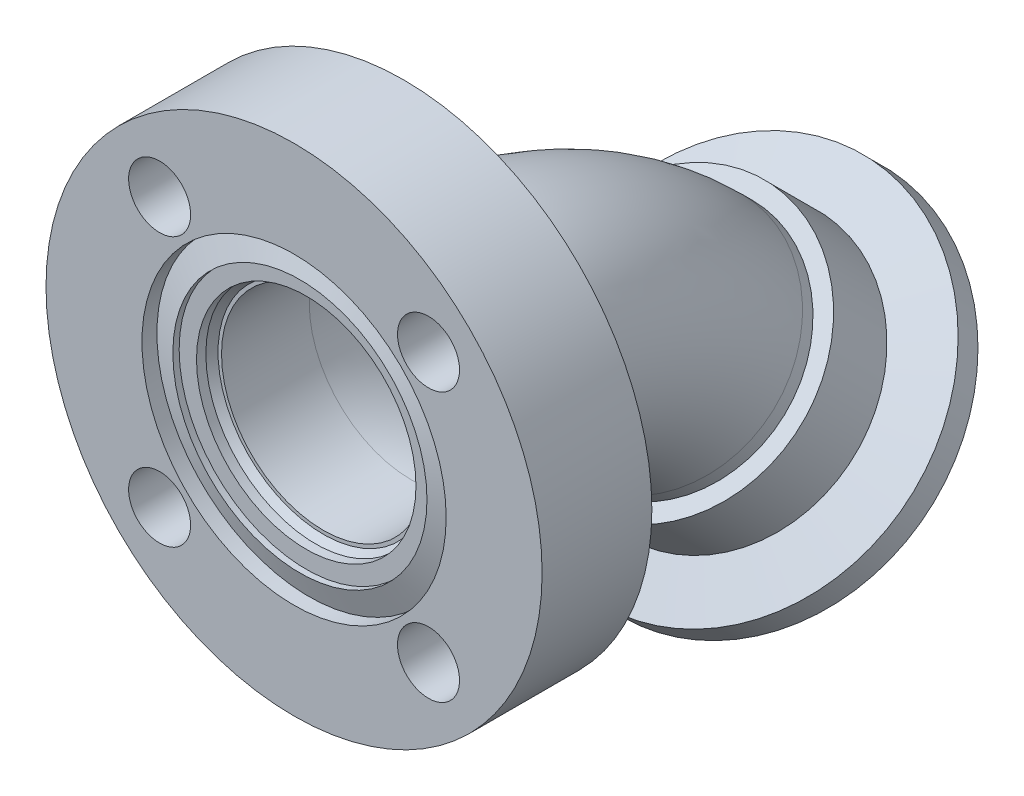
ISO-10303-21;
HEADER;
FILE_DESCRIPTION(('STEP AP214'),'2;1');
FILE_NAME('part.step','',(''),(''),'','','');
FILE_SCHEMA(('AUTOMOTIVE_DESIGN { 1 0 10303 214 1 1 1 1 }'));
ENDSEC;
DATA;
#1=APPLICATION_CONTEXT('core data for automotive mechanical design processes');
#2=APPLICATION_PROTOCOL_DEFINITION('international standard','automotive_design',2000,#1);
#3=PRODUCT_CONTEXT('',#1,'mechanical');
#4=PRODUCT('Part','Part','',(#3));
#5=PRODUCT_RELATED_PRODUCT_CATEGORY('part','',(#4));
#6=PRODUCT_DEFINITION_FORMATION('','',#4);
#7=PRODUCT_DEFINITION_CONTEXT('part definition',#1,'design');
#8=PRODUCT_DEFINITION('design','',#6,#7);
#9=PRODUCT_DEFINITION_SHAPE('','',#8);
#10=(LENGTH_UNIT() NAMED_UNIT(*) SI_UNIT(.MILLI.,.METRE.));
#11=(NAMED_UNIT(*) PLANE_ANGLE_UNIT() SI_UNIT($,.RADIAN.));
#12=(NAMED_UNIT(*) SI_UNIT($,.STERADIAN.) SOLID_ANGLE_UNIT());
#13=UNCERTAINTY_MEASURE_WITH_UNIT(LENGTH_MEASURE(1.E-05),#10,'distance_accuracy_value','');
#14=(GEOMETRIC_REPRESENTATION_CONTEXT(3) GLOBAL_UNCERTAINTY_ASSIGNED_CONTEXT((#13)) GLOBAL_UNIT_ASSIGNED_CONTEXT((#10,
#11,#12)) REPRESENTATION_CONTEXT('',''));
#15=CARTESIAN_POINT('',(0.,0.,0.));
#16=DIRECTION('',(0.,0.,1.));
#17=DIRECTION('',(1.,0.,0.));
#18=AXIS2_PLACEMENT_3D('',#15,#16,#17);
#19=CARTESIAN_POINT('',(0.,-11.1592316367926,-39.6407683632075));
#20=DIRECTION('',(0.,-0.707106781186548,-0.707106781186547));
#21=DIRECTION('',(0.,0.707106781186547,-0.707106781186548));
#22=AXIS2_PLACEMENT_3D('',#19,#20,#21);
#23=CYLINDRICAL_SURFACE('',#22,12.7);
#24=CARTESIAN_POINT('',(0.,-11.1592316367926,-39.6407683632075));
#25=DIRECTION('',(0.,0.707106781186549,0.707106781186546));
#26=DIRECTION('',(1.,0.,0.));
#27=AXIS2_PLACEMENT_3D('',#24,#25,#26);
#28=CIRCLE('',#27,12.7);
#29=CARTESIAN_POINT('',(0.,-2.17897551572345,-48.6210244842767));
#30=VERTEX_POINT('',#29);
#31=EDGE_CURVE('E103',#30,#30,#28,.T.);
#32=ORIENTED_EDGE('',*,*,#31,.F.);
#33=EDGE_LOOP('',(#32));
#34=FACE_BOUND('',#33,.T.);
#35=CARTESIAN_POINT('',(0.,-12.2907439080473,-40.7722806344622));
#36=DIRECTION('',(0.,-0.707106781186547,-0.707106781186548));
#37=DIRECTION('',(0.,0.707106781186548,-0.707106781186547));
#38=AXIS2_PLACEMENT_3D('',#35,#36,#37);
#39=CIRCLE('',#38,12.7);
#40=CARTESIAN_POINT('',(0.,-3.31048778697815,-49.7525367555314));
#41=VERTEX_POINT('',#40);
#42=EDGE_CURVE('E10',#41,#41,#39,.T.);
#43=ORIENTED_EDGE('',*,*,#42,.F.);
#44=EDGE_LOOP('',(#43));
#45=FACE_BOUND('',#44,.T.);
#46=ADVANCED_FACE('F32',(#34,#45),#23,.T.);
#47=CARTESIAN_POINT('',(0.,-17.8944237275945,-46.3759604540094));
#48=DIRECTION('',(0.,0.707106781186549,0.707106781186546));
#49=DIRECTION('',(1.,0.,0.));
#50=AXIS2_PLACEMENT_3D('',#47,#48,#49);
#51=PLANE('',#50);
#52=CARTESIAN_POINT('',(0.,-17.8944237275945,-46.3759604540094));
#53=DIRECTION('',(0.,0.707106781186549,0.707106781186546));
#54=DIRECTION('',(1.,0.,0.));
#55=AXIS2_PLACEMENT_3D('',#52,#53,#54);
#56=CIRCLE('',#55,11.049);
#57=CARTESIAN_POINT('',(0.,-10.0816009022643,-54.1887832793395));
#58=VERTEX_POINT('',#57);
#59=EDGE_CURVE('E56',#58,#58,#56,.T.);
#60=ORIENTED_EDGE('',*,*,#59,.T.);
#61=EDGE_LOOP('',(#60));
#62=FACE_BOUND('',#61,.T.);
#63=CARTESIAN_POINT('',(0.,-17.8944237275945,-46.3759604540094));
#64=DIRECTION('',(0.,0.707106781186549,0.707106781186546));
#65=DIRECTION('',(0.,-0.707106781186546,0.707106781186549));
#66=AXIS2_PLACEMENT_3D('',#63,#64,#65);
#67=CIRCLE('',#66,11.986032820047);
#68=CARTESIAN_POINT('',(0.,-26.3698288141742,-37.9005553674296));
#69=VERTEX_POINT('',#68);
#70=EDGE_CURVE('E39',#69,#69,#67,.T.);
#71=ORIENTED_EDGE('',*,*,#70,.F.);
#72=EDGE_LOOP('',(#71));
#73=FACE_BOUND('',#72,.T.);
#74=ADVANCED_FACE('F188',(#62,#73),#51,.F.);
#75=CARTESIAN_POINT('',(0.,0.,0.));
#76=DIRECTION('',(0.,0.,1.));
#77=DIRECTION('',(1.,0.,0.));
#78=AXIS2_PLACEMENT_3D('',#75,#76,#77);
#79=CYLINDRICAL_SURFACE('',#78,16.51);
#80=CARTESIAN_POINT('',(0.,0.,-1.62419830268869));
#81=DIRECTION('',(0.,0.,1.));
#82=DIRECTION('',(1.,0.,0.));
#83=AXIS2_PLACEMENT_3D('',#80,#81,#82);
#84=CIRCLE('',#83,16.51);
#85=CARTESIAN_POINT('',(16.51,0.,-1.62419830268869));
#86=VERTEX_POINT('',#85);
#87=EDGE_CURVE('E75',#86,#86,#84,.T.);
#88=ORIENTED_EDGE('',*,*,#87,.F.);
#89=EDGE_LOOP('',(#88));
#90=FACE_BOUND('',#89,.T.);
#91=CARTESIAN_POINT('',(0.,0.,0.));
#92=DIRECTION('',(0.,0.,1.));
#93=DIRECTION('',(1.,0.,0.));
#94=AXIS2_PLACEMENT_3D('',#91,#92,#93);
#95=CIRCLE('',#94,16.51);
#96=CARTESIAN_POINT('',(16.51,0.,0.));
#97=VERTEX_POINT('',#96);
#98=EDGE_CURVE('E43',#97,#97,#95,.T.);
#99=ORIENTED_EDGE('',*,*,#98,.T.);
#100=EDGE_LOOP('',(#99));
#101=FACE_BOUND('',#100,.T.);
#102=ADVANCED_FACE('F34',(#90,#101),#79,.F.);
#103=CARTESIAN_POINT('',(0.,26.924,0.));
#104=DIRECTION('',(0.,0.,-1.));
#105=DIRECTION('',(-1.,0.,0.));
#106=AXIS2_PLACEMENT_3D('',#103,#104,#105);
#107=PLANE('',#106);
#108=CARTESIAN_POINT('',(14.5923000000002,-14.5935323674563,0.));
#109=DIRECTION('',(0.,0.,1.));
#110=DIRECTION('',(0.,-1.,0.));
#111=AXIS2_PLACEMENT_3D('',#108,#109,#110);
#112=CIRCLE('',#111,3.3655);
#113=CARTESIAN_POINT('',(14.5923000000002,-17.9590323674563,0.));
#114=VERTEX_POINT('',#113);
#115=EDGE_CURVE('E53',#114,#114,#112,.T.);
#116=ORIENTED_EDGE('',*,*,#115,.F.);
#117=EDGE_LOOP('',(#116));
#118=FACE_BOUND('',#117,.T.);
#119=CARTESIAN_POINT('',(-14.5935323674565,-14.5923,0.));
#120=DIRECTION('',(0.,0.,1.));
#121=DIRECTION('',(-1.,0.,0.));
#122=AXIS2_PLACEMENT_3D('',#119,#120,#121);
#123=CIRCLE('',#122,3.3655);
#124=CARTESIAN_POINT('',(-17.9590323674565,-14.5923,0.));
#125=VERTEX_POINT('',#124);
#126=EDGE_CURVE('E91',#125,#125,#123,.T.);
#127=ORIENTED_EDGE('',*,*,#126,.F.);
#128=EDGE_LOOP('',(#127));
#129=FACE_BOUND('',#128,.T.);
#130=CARTESIAN_POINT('',(-14.5923,14.5935323674564,0.));
#131=DIRECTION('',(0.,0.,1.));
#132=DIRECTION('',(0.,1.,0.));
#133=AXIS2_PLACEMENT_3D('',#130,#131,#132);
#134=CIRCLE('',#133,3.3655);
#135=CARTESIAN_POINT('',(-14.5923000000001,17.9590323674564,0.));
#136=VERTEX_POINT('',#135);
#137=EDGE_CURVE('E85',#136,#136,#134,.T.);
#138=ORIENTED_EDGE('',*,*,#137,.F.);
#139=EDGE_LOOP('',(#138));
#140=FACE_BOUND('',#139,.T.);
#141=CARTESIAN_POINT('',(14.5935323674565,14.5923,0.));
#142=DIRECTION('',(0.,0.,1.));
#143=DIRECTION('',(1.,0.,0.));
#144=AXIS2_PLACEMENT_3D('',#141,#142,#143);
#145=CIRCLE('',#144,3.3655);
#146=CARTESIAN_POINT('',(17.9590323674565,14.5923,0.));
#147=VERTEX_POINT('',#146);
#148=EDGE_CURVE('E79',#147,#147,#145,.T.);
#149=ORIENTED_EDGE('',*,*,#148,.F.);
#150=EDGE_LOOP('',(#149));
#151=FACE_BOUND('',#150,.T.);
#152=ORIENTED_EDGE('',*,*,#98,.F.);
#153=EDGE_LOOP('',(#152));
#154=FACE_BOUND('',#153,.T.);
#155=CARTESIAN_POINT('',(0.,0.,0.));
#156=DIRECTION('',(0.,0.,1.));
#157=DIRECTION('',(1.,0.,0.));
#158=AXIS2_PLACEMENT_3D('',#155,#156,#157);
#159=CIRCLE('',#158,26.924);
#160=CARTESIAN_POINT('',(26.924,0.,0.));
#161=VERTEX_POINT('',#160);
#162=EDGE_CURVE('E47',#161,#161,#159,.T.);
#163=ORIENTED_EDGE('',*,*,#162,.T.);
#164=EDGE_LOOP('',(#163));
#165=FACE_BOUND('',#164,.T.);
#166=ADVANCED_FACE('F244',(#118,#129,#140,#151,#154,#165),#107,.F.);
#167=CARTESIAN_POINT('',(0.,0.,0.));
#168=DIRECTION('',(0.,0.,1.));
#169=DIRECTION('',(1.,0.,0.));
#170=AXIS2_PLACEMENT_3D('',#167,#168,#169);
#171=CYLINDRICAL_SURFACE('',#170,26.924);
#172=ORIENTED_EDGE('',*,*,#162,.F.);
#173=EDGE_LOOP('',(#172));
#174=FACE_BOUND('',#173,.T.);
#175=CARTESIAN_POINT('',(0.,0.,-11.9126));
#176=DIRECTION('',(0.,0.,1.));
#177=DIRECTION('',(1.,0.,0.));
#178=AXIS2_PLACEMENT_3D('',#175,#176,#177);
#179=CIRCLE('',#178,26.924);
#180=CARTESIAN_POINT('',(26.924,0.,-11.9126));
#181=VERTEX_POINT('',#180);
#182=EDGE_CURVE('E60',#181,#181,#179,.T.);
#183=ORIENTED_EDGE('',*,*,#182,.T.);
#184=EDGE_LOOP('',(#183));
#185=FACE_BOUND('',#184,.T.);
#186=ADVANCED_FACE('F241',(#174,#185),#171,.T.);
#187=CARTESIAN_POINT('',(0.,26.924,-11.9126));
#188=DIRECTION('',(0.,0.,1.));
#189=DIRECTION('',(1.,0.,0.));
#190=AXIS2_PLACEMENT_3D('',#187,#188,#189);
#191=PLANE('',#190);
#192=CARTESIAN_POINT('',(0.,0.,-11.9126));
#193=DIRECTION('',(0.,0.,1.));
#194=DIRECTION('',(1.,0.,0.));
#195=AXIS2_PLACEMENT_3D('',#192,#193,#194);
#196=CIRCLE('',#195,12.7);
#197=CARTESIAN_POINT('',(12.7,0.,-11.9126));
#198=VERTEX_POINT('',#197);
#199=EDGE_CURVE('E50',#198,#198,#196,.T.);
#200=ORIENTED_EDGE('',*,*,#199,.T.);
#201=EDGE_LOOP('',(#200));
#202=FACE_BOUND('',#201,.T.);
#203=CARTESIAN_POINT('',(14.5923000000002,-14.5935323674563,-11.9126));
#204=DIRECTION('',(0.,0.,1.));
#205=DIRECTION('',(0.,-1.,0.));
#206=AXIS2_PLACEMENT_3D('',#203,#204,#205);
#207=CIRCLE('',#206,3.3655);
#208=CARTESIAN_POINT('',(14.5923000000002,-17.9590323674563,-11.9126));
#209=VERTEX_POINT('',#208);
#210=EDGE_CURVE('E94',#209,#209,#207,.T.);
#211=ORIENTED_EDGE('',*,*,#210,.T.);
#212=EDGE_LOOP('',(#211));
#213=FACE_BOUND('',#212,.T.);
#214=CARTESIAN_POINT('',(-14.5935323674565,-14.5923,-11.9126));
#215=DIRECTION('',(0.,0.,1.));
#216=DIRECTION('',(-1.,0.,0.));
#217=AXIS2_PLACEMENT_3D('',#214,#215,#216);
#218=CIRCLE('',#217,3.3655);
#219=CARTESIAN_POINT('',(-17.9590323674565,-14.5923,-11.9126));
#220=VERTEX_POINT('',#219);
#221=EDGE_CURVE('E88',#220,#220,#218,.T.);
#222=ORIENTED_EDGE('',*,*,#221,.T.);
#223=EDGE_LOOP('',(#222));
#224=FACE_BOUND('',#223,.T.);
#225=CARTESIAN_POINT('',(-14.5923,14.5935323674564,-11.9126));
#226=DIRECTION('',(0.,0.,1.));
#227=DIRECTION('',(0.,1.,0.));
#228=AXIS2_PLACEMENT_3D('',#225,#226,#227);
#229=CIRCLE('',#228,3.3655);
#230=CARTESIAN_POINT('',(-14.5923000000001,17.9590323674564,-11.9126));
#231=VERTEX_POINT('',#230);
#232=EDGE_CURVE('E82',#231,#231,#229,.T.);
#233=ORIENTED_EDGE('',*,*,#232,.T.);
#234=EDGE_LOOP('',(#233));
#235=FACE_BOUND('',#234,.T.);
#236=CARTESIAN_POINT('',(14.5935323674565,14.5923,-11.9126));
#237=DIRECTION('',(0.,0.,1.));
#238=DIRECTION('',(1.,0.,0.));
#239=AXIS2_PLACEMENT_3D('',#236,#237,#238);
#240=CIRCLE('',#239,3.3655);
#241=CARTESIAN_POINT('',(17.9590323674565,14.5923,-11.9126));
#242=VERTEX_POINT('',#241);
#243=EDGE_CURVE('E78',#242,#242,#240,.T.);
#244=ORIENTED_EDGE('',*,*,#243,.T.);
#245=EDGE_LOOP('',(#244));
#246=FACE_BOUND('',#245,.T.);
#247=ORIENTED_EDGE('',*,*,#182,.F.);
#248=EDGE_LOOP('',(#247));
#249=FACE_BOUND('',#248,.T.);
#250=ADVANCED_FACE('F237',(#202,#213,#224,#235,#246,#249),#191,.F.);
#251=CARTESIAN_POINT('',(0.,0.,-2.3368));
#252=DIRECTION('',(0.,0.,1.));
#253=DIRECTION('',(1.,0.,0.));
#254=AXIS2_PLACEMENT_3D('',#251,#252,#253);
#255=CONICAL_SURFACE('',#254,11.9126,0.5235987755983);
#256=CARTESIAN_POINT('',(0.,0.,-3.175));
#257=DIRECTION('',(0.,0.,1.));
#258=DIRECTION('',(1.,0.,0.));
#259=AXIS2_PLACEMENT_3D('',#256,#257,#258);
#260=CIRCLE('',#259,11.4286650043653);
#261=CARTESIAN_POINT('',(11.4286650043653,0.,-3.175));
#262=VERTEX_POINT('',#261);
#263=EDGE_CURVE('E54',#262,#262,#260,.F.);
#264=ORIENTED_EDGE('',*,*,#263,.T.);
#265=EDGE_LOOP('',(#264));
#266=FACE_BOUND('',#265,.T.);
#267=CARTESIAN_POINT('',(0.,0.,-2.3368));
#268=DIRECTION('',(0.,0.,1.));
#269=DIRECTION('',(1.,0.,0.));
#270=AXIS2_PLACEMENT_3D('',#267,#268,#269);
#271=CIRCLE('',#270,11.9126);
#272=CARTESIAN_POINT('',(11.9126,0.,-2.3368));
#273=VERTEX_POINT('',#272);
#274=EDGE_CURVE('E63',#273,#273,#271,.T.);
#275=ORIENTED_EDGE('',*,*,#274,.T.);
#276=EDGE_LOOP('',(#275));
#277=FACE_BOUND('',#276,.T.);
#278=ADVANCED_FACE('F233',(#266,#277),#255,.F.);
#279=CARTESIAN_POINT('',(0.,0.,0.));
#280=DIRECTION('',(0.,0.,1.));
#281=DIRECTION('',(1.,0.,0.));
#282=AXIS2_PLACEMENT_3D('',#279,#280,#281);
#283=CYLINDRICAL_SURFACE('',#282,11.9126);
#284=ORIENTED_EDGE('',*,*,#274,.F.);
#285=EDGE_LOOP('',(#284));
#286=FACE_BOUND('',#285,.T.);
#287=CARTESIAN_POINT('',(0.,0.,-1.3208));
#288=DIRECTION('',(0.,0.,1.));
#289=DIRECTION('',(1.,0.,0.));
#290=AXIS2_PLACEMENT_3D('',#287,#288,#289);
#291=CIRCLE('',#290,11.9126);
#292=CARTESIAN_POINT('',(11.9126,0.,-1.3208));
#293=VERTEX_POINT('',#292);
#294=EDGE_CURVE('E66',#293,#293,#291,.T.);
#295=ORIENTED_EDGE('',*,*,#294,.T.);
#296=EDGE_LOOP('',(#295));
#297=FACE_BOUND('',#296,.T.);
#298=ADVANCED_FACE('F229',(#286,#297),#283,.F.);
#299=CARTESIAN_POINT('',(0.,13.7922,-1.3208));
#300=DIRECTION('',(0.,0.,-1.));
#301=DIRECTION('',(-1.,0.,0.));
#302=AXIS2_PLACEMENT_3D('',#299,#300,#301);
#303=PLANE('',#302);
#304=ORIENTED_EDGE('',*,*,#294,.F.);
#305=EDGE_LOOP('',(#304));
#306=FACE_BOUND('',#305,.T.);
#307=CARTESIAN_POINT('',(0.,0.,-1.3208));
#308=DIRECTION('',(0.,0.,1.));
#309=DIRECTION('',(1.,0.,0.));
#310=AXIS2_PLACEMENT_3D('',#307,#308,#309);
#311=CIRCLE('',#310,13.7922);
#312=CARTESIAN_POINT('',(13.7922,0.,-1.3208));
#313=VERTEX_POINT('',#312);
#314=EDGE_CURVE('E69',#313,#313,#311,.T.);
#315=ORIENTED_EDGE('',*,*,#314,.T.);
#316=EDGE_LOOP('',(#315));
#317=FACE_BOUND('',#316,.T.);
#318=ADVANCED_FACE('F225',(#306,#317),#303,.F.);
#319=CARTESIAN_POINT('',(0.,0.,0.));
#320=DIRECTION('',(0.,0.,1.));
#321=DIRECTION('',(1.,0.,0.));
#322=AXIS2_PLACEMENT_3D('',#319,#320,#321);
#323=CYLINDRICAL_SURFACE('',#322,13.7922);
#324=ORIENTED_EDGE('',*,*,#314,.F.);
#325=EDGE_LOOP('',(#324));
#326=FACE_BOUND('',#325,.T.);
#327=CARTESIAN_POINT('',(0.,0.,-0.635000000000002));
#328=DIRECTION('',(0.,0.,1.));
#329=DIRECTION('',(1.,0.,0.));
#330=AXIS2_PLACEMENT_3D('',#327,#328,#329);
#331=CIRCLE('',#330,13.7922);
#332=CARTESIAN_POINT('',(13.7922,0.,-0.635000000000002));
#333=VERTEX_POINT('',#332);
#334=EDGE_CURVE('E72',#333,#333,#331,.T.);
#335=ORIENTED_EDGE('',*,*,#334,.T.);
#336=EDGE_LOOP('',(#335));
#337=FACE_BOUND('',#336,.T.);
#338=ADVANCED_FACE('F221',(#326,#337),#323,.F.);
#339=CARTESIAN_POINT('',(0.,0.,-1.62419830268869));
#340=DIRECTION('',(0.,0.,-1.));
#341=DIRECTION('',(-1.,0.,0.));
#342=AXIS2_PLACEMENT_3D('',#339,#340,#341);
#343=CONICAL_SURFACE('',#342,16.51,1.22173047639603);
#344=ORIENTED_EDGE('',*,*,#334,.F.);
#345=EDGE_LOOP('',(#344));
#346=FACE_BOUND('',#345,.T.);
#347=ORIENTED_EDGE('',*,*,#87,.T.);
#348=EDGE_LOOP('',(#347));
#349=FACE_BOUND('',#348,.T.);
#350=ADVANCED_FACE('F217',(#346,#349),#343,.T.);
#351=CARTESIAN_POINT('',(14.5935323674565,14.5923,-11.9126));
#352=DIRECTION('',(0.,0.,1.));
#353=DIRECTION('',(1.,0.,0.));
#354=AXIS2_PLACEMENT_3D('',#351,#352,#353);
#355=CYLINDRICAL_SURFACE('',#354,3.3655);
#356=ORIENTED_EDGE('',*,*,#243,.F.);
#357=EDGE_LOOP('',(#356));
#358=FACE_BOUND('',#357,.T.);
#359=ORIENTED_EDGE('',*,*,#148,.T.);
#360=EDGE_LOOP('',(#359));
#361=FACE_BOUND('',#360,.T.);
#362=ADVANCED_FACE('F213',(#358,#361),#355,.F.);
#363=CARTESIAN_POINT('',(-14.5923,14.5935323674564,-11.9126));
#364=DIRECTION('',(0.,0.,1.));
#365=DIRECTION('',(1.,0.,0.));
#366=AXIS2_PLACEMENT_3D('',#363,#364,#365);
#367=CYLINDRICAL_SURFACE('',#366,3.3655);
#368=ORIENTED_EDGE('',*,*,#232,.F.);
#369=EDGE_LOOP('',(#368));
#370=FACE_BOUND('',#369,.T.);
#371=ORIENTED_EDGE('',*,*,#137,.T.);
#372=EDGE_LOOP('',(#371));
#373=FACE_BOUND('',#372,.T.);
#374=ADVANCED_FACE('F209',(#370,#373),#367,.F.);
#375=CARTESIAN_POINT('',(-14.5935323674565,-14.5923,-11.9126));
#376=DIRECTION('',(0.,0.,1.));
#377=DIRECTION('',(1.,0.,0.));
#378=AXIS2_PLACEMENT_3D('',#375,#376,#377);
#379=CYLINDRICAL_SURFACE('',#378,3.3655);
#380=ORIENTED_EDGE('',*,*,#221,.F.);
#381=EDGE_LOOP('',(#380));
#382=FACE_BOUND('',#381,.T.);
#383=ORIENTED_EDGE('',*,*,#126,.T.);
#384=EDGE_LOOP('',(#383));
#385=FACE_BOUND('',#384,.T.);
#386=ADVANCED_FACE('F205',(#382,#385),#379,.F.);
#387=CARTESIAN_POINT('',(14.5923000000002,-14.5935323674563,-11.9126));
#388=DIRECTION('',(0.,0.,1.));
#389=DIRECTION('',(1.,0.,0.));
#390=AXIS2_PLACEMENT_3D('',#387,#388,#389);
#391=CYLINDRICAL_SURFACE('',#390,3.3655);
#392=ORIENTED_EDGE('',*,*,#210,.F.);
#393=EDGE_LOOP('',(#392));
#394=FACE_BOUND('',#393,.T.);
#395=ORIENTED_EDGE('',*,*,#115,.T.);
#396=EDGE_LOOP('',(#395));
#397=FACE_BOUND('',#396,.T.);
#398=ADVANCED_FACE('F201',(#394,#397),#391,.F.);
#399=CARTESIAN_POINT('',(0.,0.,-12.7));
#400=DIRECTION('',(0.,0.,1.));
#401=DIRECTION('',(0.,-1.,0.));
#402=AXIS2_PLACEMENT_3D('',#399,#400,#401);
#403=CYLINDRICAL_SURFACE('',#402,12.7);
#404=CARTESIAN_POINT('',(0.,0.,-12.7));
#405=DIRECTION('',(0.,0.,1.));
#406=DIRECTION('',(1.,0.,0.));
#407=AXIS2_PLACEMENT_3D('',#404,#405,#406);
#408=CIRCLE('',#407,12.7);
#409=CARTESIAN_POINT('',(0.,12.7,-12.7));
#410=VERTEX_POINT('',#409);
#411=EDGE_CURVE('E109',#410,#410,#408,.T.);
#412=ORIENTED_EDGE('',*,*,#411,.T.);
#413=EDGE_LOOP('',(#412));
#414=FACE_BOUND('',#413,.T.);
#415=ORIENTED_EDGE('',*,*,#199,.F.);
#416=EDGE_LOOP('',(#415));
#417=FACE_BOUND('',#416,.T.);
#418=ADVANCED_FACE('F204',(#414,#417),#403,.T.);
#419=CARTESIAN_POINT('',(0.,0.,-3.175));
#420=DIRECTION('',(0.,0.,1.));
#421=DIRECTION('',(1.,0.,0.));
#422=AXIS2_PLACEMENT_3D('',#419,#420,#421);
#423=PLANE('',#422);
#424=CARTESIAN_POINT('',(0.,0.,-3.175));
#425=DIRECTION('',(0.,0.,1.));
#426=DIRECTION('',(1.,0.,0.));
#427=AXIS2_PLACEMENT_3D('',#424,#425,#426);
#428=CIRCLE('',#427,11.049);
#429=CARTESIAN_POINT('',(11.049,0.,-3.175));
#430=VERTEX_POINT('',#429);
#431=EDGE_CURVE('E110',#430,#430,#428,.T.);
#432=ORIENTED_EDGE('',*,*,#431,.F.);
#433=EDGE_LOOP('',(#432));
#434=FACE_BOUND('',#433,.T.);
#435=ORIENTED_EDGE('',*,*,#263,.F.);
#436=EDGE_LOOP('',(#435));
#437=FACE_BOUND('',#436,.T.);
#438=ADVANCED_FACE('F358',(#434,#437),#423,.T.);
#439=CARTESIAN_POINT('',(0.,-11.1592316367926,-39.6407683632075));
#440=DIRECTION('',(0.,-0.707106781186548,-0.707106781186547));
#441=DIRECTION('',(0.,0.707106781186547,-0.707106781186548));
#442=AXIS2_PLACEMENT_3D('',#439,#440,#441);
#443=CYLINDRICAL_SURFACE('',#442,11.049);
#444=CARTESIAN_POINT('',(0.,-11.1592316367926,-39.6407683632075));
#445=DIRECTION('',(0.,0.707106781186549,0.707106781186546));
#446=DIRECTION('',(1.,0.,0.));
#447=AXIS2_PLACEMENT_3D('',#444,#445,#446);
#448=CIRCLE('',#447,11.049);
#449=CARTESIAN_POINT('',(0.,-3.34640881146244,-47.4535911885377));
#450=VERTEX_POINT('',#449);
#451=EDGE_CURVE('E106',#450,#450,#448,.T.);
#452=CARTESIAN_POINT('',(0.,-3.34640881146244,-47.4535911885377));
#453=CARTESIAN_POINT('',(0.,-3.41656706240829,-47.5237494394835));
#454=CARTESIAN_POINT('',(0.,-3.48672531335415,-47.5939076904294));
#455=CARTESIAN_POINT('',(0.,-3.62704181524585,-47.7342241923211));
#456=CARTESIAN_POINT('',(0.,-3.6972000661917,-47.8043824432669));
#457=CARTESIAN_POINT('',(0.,-3.83751656808341,-47.9446989451586));
#458=CARTESIAN_POINT('',(0.,-3.90767481902926,-48.0148571961045));
#459=CARTESIAN_POINT('',(0.,-4.04799132092097,-48.1551736979962));
#460=CARTESIAN_POINT('',(0.,-4.11814957186682,-48.2253319489421));
#461=CARTESIAN_POINT('',(0.,-4.25846607375852,-48.3656484508338));
#462=CARTESIAN_POINT('',(0.,-4.32862432470438,-48.4358067017796));
#463=CARTESIAN_POINT('',(0.,-4.46894082659608,-48.5761232036713));
#464=CARTESIAN_POINT('',(0.,-4.53909907754194,-48.6462814546172));
#465=CARTESIAN_POINT('',(0.,-4.67941557943364,-48.7865979565089));
#466=CARTESIAN_POINT('',(0.,-4.74957383037949,-48.8567562074547));
#467=CARTESIAN_POINT('',(0.,-4.8898903322712,-48.9970727093464));
#468=CARTESIAN_POINT('',(0.,-4.96004858321705,-49.0672309602923));
#469=CARTESIAN_POINT('',(0.,-5.10036508510876,-49.207547462184));
#470=CARTESIAN_POINT('',(0.,-5.17052333605461,-49.2777057131298));
#471=CARTESIAN_POINT('',(0.,-5.31083983794632,-49.4180222150216));
#472=CARTESIAN_POINT('',(0.,-5.38099808889217,-49.4881804659674));
#473=CARTESIAN_POINT('',(0.,-5.52131459078388,-49.6284969678591));
#474=CARTESIAN_POINT('',(0.,-5.59147284172973,-49.698655218805));
#475=CARTESIAN_POINT('',(0.,-5.73178934362143,-49.8389717206967));
#476=CARTESIAN_POINT('',(0.,-5.80194759456729,-49.9091299716425));
#477=CARTESIAN_POINT('',(0.,-5.94226409645899,-50.0494464735342));
#478=CARTESIAN_POINT('',(0.,-6.01242234740484,-50.1196047244801));
#479=CARTESIAN_POINT('',(0.,-6.15273884929655,-50.2599212263718));
#480=CARTESIAN_POINT('',(0.,-6.2228971002424,-50.3300794773176));
#481=CARTESIAN_POINT('',(0.,-6.36321360213411,-50.4703959792093));
#482=CARTESIAN_POINT('',(0.,-6.43337185307996,-50.5405542301552));
#483=CARTESIAN_POINT('',(0.,-6.57368835497167,-50.6808707320469));
#484=CARTESIAN_POINT('',(0.,-6.64384660591752,-50.7510289829927));
#485=CARTESIAN_POINT('',(0.,-6.78416310780922,-50.8913454848845));
#486=CARTESIAN_POINT('',(0.,-6.85432135875508,-50.9615037358303));
#487=CARTESIAN_POINT('',(0.,-6.99463786064678,-51.101820237722));
#488=CARTESIAN_POINT('',(0.,-7.06479611159263,-51.1719784886679));
#489=CARTESIAN_POINT('',(0.,-7.20511261348434,-51.3122949905596));
#490=CARTESIAN_POINT('',(0.,-7.27527086443019,-51.3824532415054));
#491=CARTESIAN_POINT('',(0.,-7.4155873663219,-51.5227697433971));
#492=CARTESIAN_POINT('',(0.,-7.48574561726775,-51.592927994343));
#493=CARTESIAN_POINT('',(0.,-7.62606211915946,-51.7332444962347));
#494=CARTESIAN_POINT('',(0.,-7.69622037010531,-51.8034027471805));
#495=CARTESIAN_POINT('',(0.,-7.83653687199702,-51.9437192490722));
#496=CARTESIAN_POINT('',(0.,-7.90669512294287,-52.0138775000181));
#497=CARTESIAN_POINT('',(0.,-8.04701162483457,-52.1541940019098));
#498=CARTESIAN_POINT('',(0.,-8.11716987578043,-52.2243522528557));
#499=CARTESIAN_POINT('',(0.,-8.25748637767213,-52.3646687547474));
#500=CARTESIAN_POINT('',(0.,-8.32764462861798,-52.4348270056932));
#501=CARTESIAN_POINT('',(0.,-8.46796113050969,-52.5751435075849));
#502=CARTESIAN_POINT('',(0.,-8.53811938145554,-52.6453017585308));
#503=CARTESIAN_POINT('',(0.,-8.67843588334725,-52.7856182604225));
#504=CARTESIAN_POINT('',(0.,-8.7485941342931,-52.8557765113683));
#505=CARTESIAN_POINT('',(0.,-8.88891063618481,-52.99609301326));
#506=CARTESIAN_POINT('',(0.,-8.95906888713066,-53.0662512642059));
#507=CARTESIAN_POINT('',(0.,-9.09938538902237,-53.2065677660976));
#508=CARTESIAN_POINT('',(0.,-9.16954363996822,-53.2767260170434));
#509=CARTESIAN_POINT('',(0.,-9.30986014185993,-53.4170425189352));
#510=CARTESIAN_POINT('',(0.,-9.38001839280578,-53.487200769881));
#511=CARTESIAN_POINT('',(0.,-9.52033489469748,-53.6275172717727));
#512=CARTESIAN_POINT('',(0.,-9.59049314564333,-53.6976755227186));
#513=CARTESIAN_POINT('',(0.,-9.73080964753504,-53.8379920246103));
#514=CARTESIAN_POINT('',(0.,-9.80096789848089,-53.9081502755561));
#515=CARTESIAN_POINT('',(0.,-9.9412844003726,-54.0484667774478));
#516=CARTESIAN_POINT('',(0.,-10.0114426513184,-54.1186250283937));
#517=CARTESIAN_POINT('',(0.,-10.0816009022643,-54.1887832793395));
#518=B_SPLINE_CURVE_WITH_KNOTS('',3,(#452,#453,#454,#455,#456,#457,#458,#459,#460,#461,#462,
#463,#464,#465,#466,#467,#468,#469,#470,#471,#472,#473,#474,#475,#476,#477,#478,#479,#480,#481,
#482,#483,#484,#485,#486,#487,#488,#489,#490,#491,#492,#493,#494,#495,#496,#497,#498,#499,#500,
#501,#502,#503,#504,#505,#506,#507,#508,#509,#510,#511,#512,#513,#514,#515,#516,#517),
.UNSPECIFIED.,.F.,.F.,(4,2,2,2,2,2,2,2,2,2,2,2,2,2,2,2,2,2,2,2,2,2,2,2,2,2,2,2,2,2,2,2,4),(0.,
0.29765625,0.5953125,0.89296875,1.190625,1.48828125,1.7859375,2.08359375,2.38125,2.67890625,
2.9765625,3.27421875,3.571875,3.86953125,4.1671875,4.46484374999999,4.7625,5.06015625,5.3578125,
5.65546875,5.953125,6.25078125,6.5484375,6.84609375,7.14375,7.44140625,7.7390625,8.03671875,
8.334375,8.63203125,8.92968749999999,9.22734375,9.525),.UNSPECIFIED.);
#519=EDGE_CURVE('BSEAM199',#450,#58,#518,.T.);
#520=ORIENTED_EDGE('',*,*,#451,.T.);
#521=ORIENTED_EDGE('',*,*,#59,.F.);
#522=ORIENTED_EDGE('',*,*,#519,.T.);
#523=ORIENTED_EDGE('',*,*,#519,.F.);
#524=EDGE_LOOP('',(#520,#522,#521,#523));
#525=FACE_BOUND('',#524,.T.);
#526=ADVANCED_FACE('F199',(#525),#443,.F.);
#527=CARTESIAN_POINT('',(0.,-38.1,-12.7));
#528=DIRECTION('',(-1.,0.,0.));
#529=DIRECTION('',(0.,0.,1.));
#530=AXIS2_PLACEMENT_3D('',#527,#528,#529);
#531=TOROIDAL_SURFACE('',#530,38.1,12.7);
#532=CARTESIAN_POINT('',(0.,-38.1,-12.7));
#533=DIRECTION('',(-1.,0.,0.));
#534=DIRECTION('',(0.,0.,1.));
#535=AXIS2_PLACEMENT_3D('',#532,#533,#534);
#536=CIRCLE('',#535,50.8);
#537=EDGE_CURVE('',#410,#30,#536,.T.);
#538=ORIENTED_EDGE('',*,*,#411,.F.);
#539=ORIENTED_EDGE('',*,*,#31,.T.);
#540=ORIENTED_EDGE('',*,*,#537,.T.);
#541=ORIENTED_EDGE('',*,*,#537,.F.);
#542=EDGE_LOOP('',(#538,#540,#539,#541));
#543=FACE_BOUND('',#542,.T.);
#544=ADVANCED_FACE('F344',(#543),#531,.T.);
#545=CARTESIAN_POINT('',(0.,-38.1,-12.7));
#546=DIRECTION('',(-1.,0.,0.));
#547=DIRECTION('',(0.,0.,1.));
#548=AXIS2_PLACEMENT_3D('',#545,#546,#547);
#549=TOROIDAL_SURFACE('',#548,38.1,11.049);
#550=CARTESIAN_POINT('',(0.,0.,-12.7));
#551=DIRECTION('',(0.,0.,1.));
#552=DIRECTION('',(1.,0.,0.));
#553=AXIS2_PLACEMENT_3D('',#550,#551,#552);
#554=CIRCLE('',#553,11.049);
#555=CARTESIAN_POINT('',(0.,11.049,-12.7));
#556=VERTEX_POINT('',#555);
#557=EDGE_CURVE('E113',#556,#556,#554,.T.);
#558=CARTESIAN_POINT('',(0.,-38.1,-12.7));
#559=DIRECTION('',(-1.,0.,0.));
#560=DIRECTION('',(0.,0.,1.));
#561=AXIS2_PLACEMENT_3D('',#558,#559,#560);
#562=CIRCLE('',#561,49.149);
#563=EDGE_CURVE('',#556,#450,#562,.T.);
#564=ORIENTED_EDGE('',*,*,#557,.T.);
#565=ORIENTED_EDGE('',*,*,#451,.F.);
#566=ORIENTED_EDGE('',*,*,#563,.T.);
#567=ORIENTED_EDGE('',*,*,#563,.F.);
#568=EDGE_LOOP('',(#564,#566,#565,#567));
#569=FACE_BOUND('',#568,.T.);
#570=ADVANCED_FACE('F337',(#569),#549,.F.);
#571=CARTESIAN_POINT('',(0.,0.,-12.7));
#572=DIRECTION('',(0.,0.,1.));
#573=DIRECTION('',(0.,-1.,0.));
#574=AXIS2_PLACEMENT_3D('',#571,#572,#573);
#575=CYLINDRICAL_SURFACE('',#574,11.049);
#576=ORIENTED_EDGE('',*,*,#557,.F.);
#577=EDGE_LOOP('',(#576));
#578=FACE_BOUND('',#577,.T.);
#579=ORIENTED_EDGE('',*,*,#431,.T.);
#580=EDGE_LOOP('',(#579));
#581=FACE_BOUND('',#580,.T.);
#582=ADVANCED_FACE('F184',(#578,#581),#575,.F.);
#583=CARTESIAN_POINT('',(0.,-2.01928759725369,-51.0437369452558));
#584=DIRECTION('',(0.,-0.707106781186547,-0.707106781186548));
#585=DIRECTION('',(0.,0.707106781186548,-0.707106781186547));
#586=AXIS2_PLACEMENT_3D('',#583,#584,#585);
#587=PLANE('',#586);
#588=CARTESIAN_POINT('',(0.,-12.2907439080473,-40.7722806344622));
#589=DIRECTION('',(0.,0.707106781186547,0.707106781186548));
#590=DIRECTION('',(0.,-0.707106781186548,0.707106781186547));
#591=AXIS2_PLACEMENT_3D('',#588,#589,#590);
#592=CIRCLE('',#591,14.526032820047);
#593=CARTESIAN_POINT('',(0.,-22.5622002188409,-30.5008243236686));
#594=VERTEX_POINT('',#593);
#595=EDGE_CURVE('E136',#594,#594,#592,.T.);
#596=ORIENTED_EDGE('',*,*,#595,.T.);
#597=EDGE_LOOP('',(#596));
#598=FACE_BOUND('',#597,.T.);
#599=ORIENTED_EDGE('',*,*,#42,.T.);
#600=EDGE_LOOP('',(#599));
#601=FACE_BOUND('',#600,.T.);
#602=ADVANCED_FACE('F140',(#598,#601),#587,.F.);
#603=CARTESIAN_POINT('',(0.,-17.8944237275945,-46.3759604540094));
#604=DIRECTION('',(0.,0.707106781186547,0.707106781186548));
#605=DIRECTION('',(0.,-0.707106781186548,0.707106781186547));
#606=AXIS2_PLACEMENT_3D('',#603,#604,#605);
#607=CYLINDRICAL_SURFACE('',#606,11.986032820047);
#608=CARTESIAN_POINT('',(0.,-19.4749488049026,-47.9564855313175));
#609=DIRECTION('',(0.,0.707106781186547,0.707106781186548));
#610=DIRECTION('',(0.,-0.707106781186548,0.707106781186547));
#611=AXIS2_PLACEMENT_3D('',#608,#609,#610);
#612=CIRCLE('',#611,11.986032820047);
#613=CARTESIAN_POINT('',(0.,-27.9503538914824,-39.4810804447377));
#614=VERTEX_POINT('',#613);
#615=EDGE_CURVE('E114',#614,#614,#612,.T.);
#616=ORIENTED_EDGE('',*,*,#615,.F.);
#617=EDGE_LOOP('',(#616));
#618=FACE_BOUND('',#617,.T.);
#619=ORIENTED_EDGE('',*,*,#70,.T.);
#620=EDGE_LOOP('',(#619));
#621=FACE_BOUND('',#620,.T.);
#622=ADVANCED_FACE('F175',(#618,#621),#607,.F.);
#623=CARTESIAN_POINT('',(0.,-10.9995437183228,-56.4318906178973));
#624=DIRECTION('',(0.,0.707106781186547,0.707106781186548));
#625=DIRECTION('',(0.,-0.707106781186548,0.707106781186547));
#626=AXIS2_PLACEMENT_3D('',#623,#624,#625);
#627=PLANE('',#626);
#628=CARTESIAN_POINT('',(0.,-19.4749488049026,-47.9564855313175));
#629=DIRECTION('',(0.,0.707106781186547,0.707106781186548));
#630=DIRECTION('',(0.,-0.707106781186548,0.707106781186547));
#631=AXIS2_PLACEMENT_3D('',#628,#629,#630);
#632=CIRCLE('',#631,13.1064);
#633=CARTESIAN_POINT('',(0.,-28.742573121846,-38.6888612143742));
#634=VERTEX_POINT('',#633);
#635=EDGE_CURVE('E121',#634,#634,#632,.T.);
#636=ORIENTED_EDGE('',*,*,#635,.F.);
#637=EDGE_LOOP('',(#636));
#638=FACE_BOUND('',#637,.T.);
#639=ORIENTED_EDGE('',*,*,#615,.T.);
#640=EDGE_LOOP('',(#639));
#641=FACE_BOUND('',#640,.T.);
#642=ADVANCED_FACE('F169',(#638,#641),#627,.F.);
#643=CARTESIAN_POINT('',(0.,-17.8944237275945,-46.3759604540094));
#644=DIRECTION('',(0.,0.707106781186547,0.707106781186548));
#645=DIRECTION('',(0.,-0.707106781186548,0.707106781186547));
#646=AXIS2_PLACEMENT_3D('',#643,#644,#645);
#647=CYLINDRICAL_SURFACE('',#646,13.1064);
#648=CARTESIAN_POINT('',(0.,-21.2710000291165,-49.7525367555314));
#649=DIRECTION('',(0.,0.707106781186547,0.707106781186548));
#650=DIRECTION('',(0.,-0.707106781186548,0.707106781186547));
#651=AXIS2_PLACEMENT_3D('',#648,#649,#650);
#652=CIRCLE('',#651,13.1064);
#653=CARTESIAN_POINT('',(0.,-30.5386243460598,-40.484912438588));
#654=VERTEX_POINT('',#653);
#655=EDGE_CURVE('E124',#654,#654,#652,.T.);
#656=ORIENTED_EDGE('',*,*,#655,.F.);
#657=EDGE_LOOP('',(#656));
#658=FACE_BOUND('',#657,.T.);
#659=ORIENTED_EDGE('',*,*,#635,.T.);
#660=EDGE_LOOP('',(#659));
#661=FACE_BOUND('',#660,.T.);
#662=ADVANCED_FACE('F163',(#658,#661),#647,.F.);
#663=CARTESIAN_POINT('',(0.,-12.0033757121731,-59.0201610724747));
#664=DIRECTION('',(0.,0.707106781186547,0.707106781186548));
#665=DIRECTION('',(0.,-0.707106781186548,0.707106781186547));
#666=AXIS2_PLACEMENT_3D('',#663,#664,#665);
#667=PLANE('',#666);
#668=CARTESIAN_POINT('',(0.,-21.2710000291165,-49.7525367555314));
#669=DIRECTION('',(0.,0.707106781186547,0.707106781186548));
#670=DIRECTION('',(0.,-0.707106781186548,0.707106781186547));
#671=AXIS2_PLACEMENT_3D('',#668,#669,#670);
#672=CIRCLE('',#671,19.9898);
#673=CARTESIAN_POINT('',(0.,-35.4059231636793,-35.6176136209685));
#674=VERTEX_POINT('',#673);
#675=EDGE_CURVE('E127',#674,#674,#672,.T.);
#676=ORIENTED_EDGE('',*,*,#675,.F.);
#677=EDGE_LOOP('',(#676));
#678=FACE_BOUND('',#677,.T.);
#679=ORIENTED_EDGE('',*,*,#655,.T.);
#680=EDGE_LOOP('',(#679));
#681=FACE_BOUND('',#680,.T.);
#682=ADVANCED_FACE('F157',(#678,#681),#667,.F.);
#683=CARTESIAN_POINT('',(0.,-17.8944237275945,-46.3759604540094));
#684=DIRECTION('',(0.,0.707106781186547,0.707106781186548));
#685=DIRECTION('',(0.,-0.707106781186548,0.707106781186547));
#686=AXIS2_PLACEMENT_3D('',#683,#684,#685);
#687=CYLINDRICAL_SURFACE('',#686,19.9898);
#688=CARTESIAN_POINT('',(0.,-19.1157385600599,-47.5972752864748));
#689=DIRECTION('',(0.,0.707106781186547,0.707106781186548));
#690=DIRECTION('',(0.,-0.707106781186548,0.707106781186547));
#691=AXIS2_PLACEMENT_3D('',#688,#689,#690);
#692=CIRCLE('',#691,19.9898);
#693=CARTESIAN_POINT('',(0.,-33.2506616946227,-33.4623521519119));
#694=VERTEX_POINT('',#693);
#695=EDGE_CURVE('E130',#694,#694,#692,.T.);
#696=ORIENTED_EDGE('',*,*,#695,.F.);
#697=EDGE_LOOP('',(#696));
#698=FACE_BOUND('',#697,.T.);
#699=ORIENTED_EDGE('',*,*,#675,.T.);
#700=EDGE_LOOP('',(#699));
#701=FACE_BOUND('',#700,.T.);
#702=ADVANCED_FACE('F151',(#698,#701),#687,.T.);
#703=CARTESIAN_POINT('',(0.,-19.1157385600599,-47.5972752864748));
#704=DIRECTION('',(0.,-0.707106781186547,-0.707106781186548));
#705=DIRECTION('',(0.,0.707106781186548,-0.707106781186547));
#706=AXIS2_PLACEMENT_3D('',#703,#704,#705);
#707=CONICAL_SURFACE('',#706,19.9898,1.30899693899575);
#708=CARTESIAN_POINT('',(0.,-18.0805257446465,-46.5620624710614));
#709=DIRECTION('',(0.,0.707106781186547,0.707106781186548));
#710=DIRECTION('',(0.,-0.707106781186548,0.707106781186547));
#711=AXIS2_PLACEMENT_3D('',#708,#709,#710);
#712=CIRCLE('',#711,14.526032820047);
#713=CARTESIAN_POINT('',(0.,-28.3519820554401,-36.2906061602678));
#714=VERTEX_POINT('',#713);
#715=EDGE_CURVE('E133',#714,#714,#712,.T.);
#716=ORIENTED_EDGE('',*,*,#715,.F.);
#717=EDGE_LOOP('',(#716));
#718=FACE_BOUND('',#717,.T.);
#719=ORIENTED_EDGE('',*,*,#695,.T.);
#720=EDGE_LOOP('',(#719));
#721=FACE_BOUND('',#720,.T.);
#722=ADVANCED_FACE('F145',(#718,#721),#707,.T.);
#723=CARTESIAN_POINT('',(0.,-17.8944237275945,-46.3759604540094));
#724=DIRECTION('',(0.,0.707106781186547,0.707106781186548));
#725=DIRECTION('',(0.,-0.707106781186548,0.707106781186547));
#726=AXIS2_PLACEMENT_3D('',#723,#724,#725);
#727=CYLINDRICAL_SURFACE('',#726,14.526032820047);
#728=ORIENTED_EDGE('',*,*,#595,.F.);
#729=EDGE_LOOP('',(#728));
#730=FACE_BOUND('',#729,.T.);
#731=ORIENTED_EDGE('',*,*,#715,.T.);
#732=EDGE_LOOP('',(#731));
#733=FACE_BOUND('',#732,.T.);
#734=ADVANCED_FACE('F142',(#730,#733),#727,.T.);
#735=CLOSED_SHELL('',(#46,#74,#102,#166,#186,#250,#278,#298,#318,#338,#350,#362,#374,#386,#398,
#418,#438,#526,#544,#570,#582,#602,#622,#642,#662,#682,#702,#722,#734));
#736=MANIFOLD_SOLID_BREP('B2',#735);
#737=ADVANCED_BREP_SHAPE_REPRESENTATION('',(#18,#736),#14);
#738=SHAPE_DEFINITION_REPRESENTATION(#9,#737);
ENDSEC;
END-ISO-10303-21;
